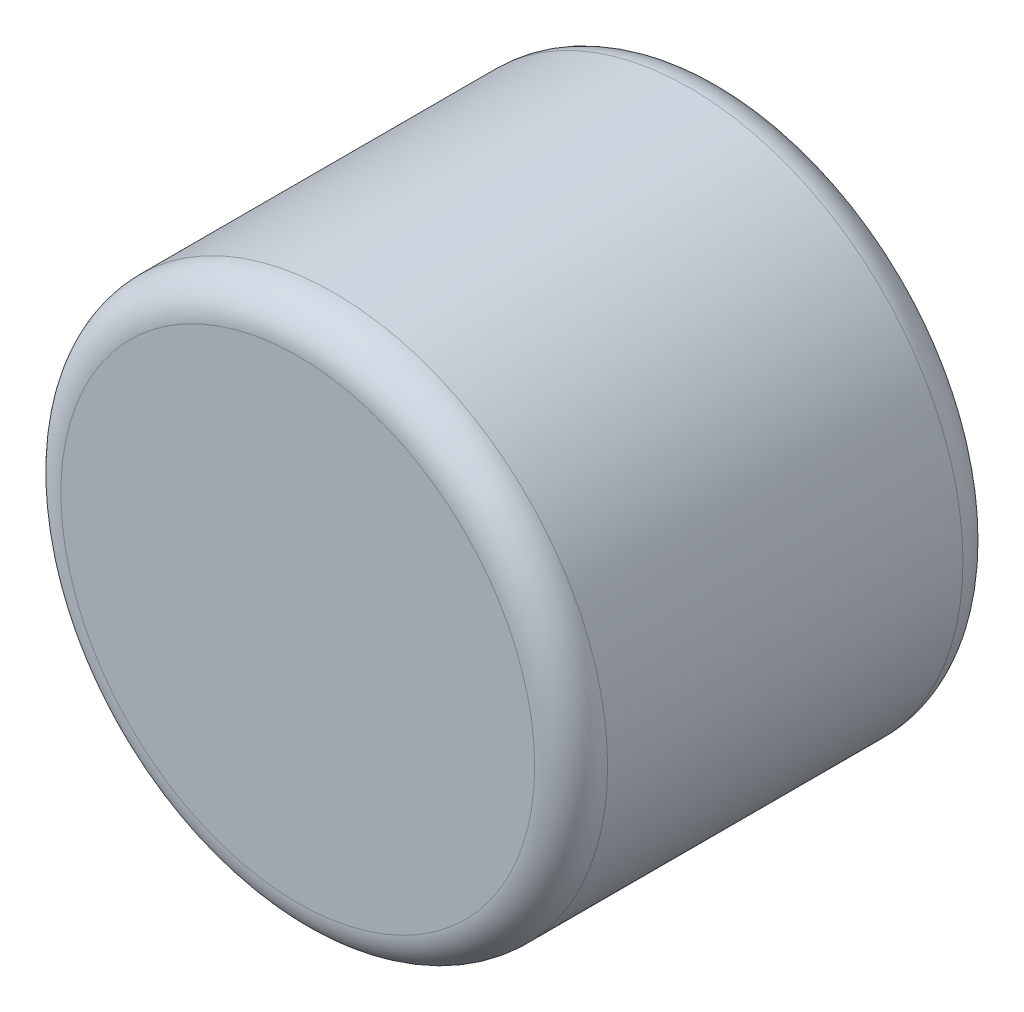
ISO-10303-21;
HEADER;
FILE_DESCRIPTION(('STEP AP214'),'2;1');
FILE_NAME('part.step','',(''),(''),'','','');
FILE_SCHEMA(('AUTOMOTIVE_DESIGN { 1 0 10303 214 1 1 1 1 }'));
ENDSEC;
DATA;
#1=APPLICATION_CONTEXT('core data for automotive mechanical design processes');
#2=APPLICATION_PROTOCOL_DEFINITION('international standard','automotive_design',2000,#1);
#3=PRODUCT_CONTEXT('',#1,'mechanical');
#4=PRODUCT('Part','Part','',(#3));
#5=PRODUCT_RELATED_PRODUCT_CATEGORY('part','',(#4));
#6=PRODUCT_DEFINITION_FORMATION('','',#4);
#7=PRODUCT_DEFINITION_CONTEXT('part definition',#1,'design');
#8=PRODUCT_DEFINITION('design','',#6,#7);
#9=PRODUCT_DEFINITION_SHAPE('','',#8);
#10=(LENGTH_UNIT() NAMED_UNIT(*) SI_UNIT(.MILLI.,.METRE.));
#11=(NAMED_UNIT(*) PLANE_ANGLE_UNIT() SI_UNIT($,.RADIAN.));
#12=(NAMED_UNIT(*) SI_UNIT($,.STERADIAN.) SOLID_ANGLE_UNIT());
#13=UNCERTAINTY_MEASURE_WITH_UNIT(LENGTH_MEASURE(1.E-05),#10,'distance_accuracy_value','');
#14=(GEOMETRIC_REPRESENTATION_CONTEXT(3) GLOBAL_UNCERTAINTY_ASSIGNED_CONTEXT((#13)) GLOBAL_UNIT_ASSIGNED_CONTEXT((#10,
#11,#12)) REPRESENTATION_CONTEXT('',''));
#15=CARTESIAN_POINT('',(0.,0.,0.));
#16=DIRECTION('',(0.,0.,1.));
#17=DIRECTION('',(1.,0.,0.));
#18=AXIS2_PLACEMENT_3D('',#15,#16,#17);
#19=CARTESIAN_POINT('',(0.,0.,2.75));
#20=DIRECTION('',(0.,0.,1.));
#21=DIRECTION('',(1.,0.,0.));
#22=AXIS2_PLACEMENT_3D('',#19,#20,#21);
#23=CYLINDRICAL_SURFACE('',#22,3.05);
#24=CARTESIAN_POINT('',(0.,0.,9.75));
#25=DIRECTION('',(0.,0.,1.));
#26=DIRECTION('',(1.,0.,0.));
#27=AXIS2_PLACEMENT_3D('',#24,#25,#26);
#28=CIRCLE('',#27,3.05);
#29=CARTESIAN_POINT('',(2.6556543449779,-1.5,9.75));
#30=VERTEX_POINT('',#29);
#31=CARTESIAN_POINT('',(-2.6556543449779,-1.5,9.75));
#32=VERTEX_POINT('',#31);
#33=EDGE_CURVE('E75',#30,#32,#28,.T.);
#34=ORIENTED_EDGE('',*,*,#33,.T.);
#35=DIRECTION('',(0.,0.,1.));
#36=VECTOR('',#35,1.);
#37=CARTESIAN_POINT('',(-2.6556543449779,-1.5,2.75));
#38=LINE('',#37,#36);
#39=CARTESIAN_POINT('',(-2.6556543449779,-1.5,2.75));
#40=VERTEX_POINT('',#39);
#41=EDGE_CURVE('E64',#40,#32,#38,.T.);
#42=ORIENTED_EDGE('',*,*,#41,.F.);
#43=CARTESIAN_POINT('',(0.,0.,2.75));
#44=DIRECTION('',(0.,0.,-1.));
#45=DIRECTION('',(-1.,0.,0.));
#46=AXIS2_PLACEMENT_3D('',#43,#44,#45);
#47=CIRCLE('',#46,3.05);
#48=CARTESIAN_POINT('',(2.6556543449779,-1.5,2.75));
#49=VERTEX_POINT('',#48);
#50=EDGE_CURVE('E54',#49,#40,#47,.T.);
#51=ORIENTED_EDGE('',*,*,#50,.F.);
#52=DIRECTION('',(0.,0.,1.));
#53=VECTOR('',#52,1.);
#54=CARTESIAN_POINT('',(2.6556543449779,-1.5,2.75));
#55=LINE('',#54,#53);
#56=EDGE_CURVE('E73',#49,#30,#55,.T.);
#57=ORIENTED_EDGE('',*,*,#56,.T.);
#58=EDGE_LOOP('',(#34,#42,#51,#57));
#59=FACE_BOUND('',#58,.T.);
#60=CARTESIAN_POINT('',(0.,0.,0.));
#61=DIRECTION('',(0.,0.,-1.));
#62=DIRECTION('',(-1.,0.,0.));
#63=AXIS2_PLACEMENT_3D('',#60,#61,#62);
#64=CIRCLE('',#63,3.05);
#65=CARTESIAN_POINT('',(-3.05,0.,0.));
#66=VERTEX_POINT('',#65);
#67=EDGE_CURVE('E76',#66,#66,#64,.T.);
#68=ORIENTED_EDGE('',*,*,#67,.T.);
#69=EDGE_LOOP('',(#68));
#70=FACE_BOUND('',#69,.T.);
#71=ADVANCED_FACE('F39',(#59,#70),#23,.F.);
#72=CARTESIAN_POINT('',(-2.6556543449779,-1.5,2.75));
#73=DIRECTION('',(0.,-1.,0.));
#74=DIRECTION('',(0.,0.,-1.));
#75=AXIS2_PLACEMENT_3D('',#72,#73,#74);
#76=PLANE('',#75);
#77=DIRECTION('',(1.,0.,0.));
#78=VECTOR('',#77,1.);
#79=CARTESIAN_POINT('',(-2.6556543449779,-1.5,9.75));
#80=LINE('',#79,#78);
#81=EDGE_CURVE('E69',#32,#30,#80,.T.);
#82=ORIENTED_EDGE('',*,*,#81,.T.);
#83=ORIENTED_EDGE('',*,*,#56,.F.);
#84=DIRECTION('',(1.,0.,0.));
#85=VECTOR('',#84,1.);
#86=CARTESIAN_POINT('',(-2.6556543449779,-1.5,2.75));
#87=LINE('',#86,#85);
#88=EDGE_CURVE('E66',#40,#49,#87,.T.);
#89=ORIENTED_EDGE('',*,*,#88,.F.);
#90=ORIENTED_EDGE('',*,*,#41,.T.);
#91=EDGE_LOOP('',(#82,#83,#89,#90));
#92=FACE_BOUND('',#91,.T.);
#93=ADVANCED_FACE('F78',(#92),#76,.F.);
#94=CARTESIAN_POINT('',(0.,0.,9.75));
#95=DIRECTION('',(0.,0.,1.));
#96=DIRECTION('',(1.,0.,0.));
#97=AXIS2_PLACEMENT_3D('',#94,#95,#96);
#98=PLANE('',#97);
#99=ORIENTED_EDGE('',*,*,#33,.F.);
#100=ORIENTED_EDGE('',*,*,#81,.F.);
#101=EDGE_LOOP('',(#99,#100));
#102=FACE_BOUND('',#101,.T.);
#103=ADVANCED_FACE('F118',(#102),#98,.F.);
#104=CARTESIAN_POINT('',(0.,0.,2.75));
#105=DIRECTION('',(0.,0.,-1.));
#106=DIRECTION('',(-1.,0.,0.));
#107=AXIS2_PLACEMENT_3D('',#104,#105,#106);
#108=PLANE('',#107);
#109=ORIENTED_EDGE('',*,*,#88,.T.);
#110=ORIENTED_EDGE('',*,*,#50,.T.);
#111=EDGE_LOOP('',(#109,#110));
#112=FACE_BOUND('',#111,.T.);
#113=ADVANCED_FACE('F67',(#112),#108,.T.);
#114=CARTESIAN_POINT('',(0.,0.,11.75));
#115=DIRECTION('',(0.,0.,-1.));
#116=DIRECTION('',(-1.,0.,0.));
#117=AXIS2_PLACEMENT_3D('',#114,#115,#116);
#118=CYLINDRICAL_SURFACE('',#117,7.5);
#119=CARTESIAN_POINT('',(0.,0.,10.75));
#120=DIRECTION('',(0.,0.,1.));
#121=DIRECTION('',(1.,0.,0.));
#122=AXIS2_PLACEMENT_3D('',#119,#120,#121);
#123=CIRCLE('',#122,7.5);
#124=CARTESIAN_POINT('',(7.5,0.,10.75));
#125=VERTEX_POINT('',#124);
#126=EDGE_CURVE('E48',#125,#125,#123,.F.);
#127=ORIENTED_EDGE('',*,*,#126,.T.);
#128=EDGE_LOOP('',(#127));
#129=FACE_BOUND('',#128,.T.);
#130=CARTESIAN_POINT('',(0.,0.,1.));
#131=DIRECTION('',(0.,0.,1.));
#132=DIRECTION('',(1.,0.,0.));
#133=AXIS2_PLACEMENT_3D('',#130,#131,#132);
#134=CIRCLE('',#133,7.5);
#135=CARTESIAN_POINT('',(7.5,0.,1.));
#136=VERTEX_POINT('',#135);
#137=EDGE_CURVE('E83',#136,#136,#134,.T.);
#138=ORIENTED_EDGE('',*,*,#137,.T.);
#139=EDGE_LOOP('',(#138));
#140=FACE_BOUND('',#139,.T.);
#141=ADVANCED_FACE('F93',(#129,#140),#118,.T.);
#142=CARTESIAN_POINT('',(0.,0.,11.75));
#143=DIRECTION('',(0.,0.,1.));
#144=DIRECTION('',(1.,0.,0.));
#145=AXIS2_PLACEMENT_3D('',#142,#143,#144);
#146=PLANE('',#145);
#147=CARTESIAN_POINT('',(0.,0.,11.75));
#148=DIRECTION('',(0.,0.,1.));
#149=DIRECTION('',(1.,0.,0.));
#150=AXIS2_PLACEMENT_3D('',#147,#148,#149);
#151=CIRCLE('',#150,6.5);
#152=CARTESIAN_POINT('',(6.5,0.,11.75));
#153=VERTEX_POINT('',#152);
#154=EDGE_CURVE('E80',#153,#153,#151,.T.);
#155=ORIENTED_EDGE('',*,*,#154,.T.);
#156=EDGE_LOOP('',(#155));
#157=FACE_BOUND('',#156,.T.);
#158=ADVANCED_FACE('F102',(#157),#146,.T.);
#159=CARTESIAN_POINT('',(0.,0.,0.));
#160=DIRECTION('',(0.,0.,1.));
#161=DIRECTION('',(1.,0.,0.));
#162=AXIS2_PLACEMENT_3D('',#159,#160,#161);
#163=PLANE('',#162);
#164=ORIENTED_EDGE('',*,*,#67,.F.);
#165=EDGE_LOOP('',(#164));
#166=FACE_BOUND('',#165,.T.);
#167=CARTESIAN_POINT('',(0.,0.,0.));
#168=DIRECTION('',(0.,0.,1.));
#169=DIRECTION('',(1.,0.,0.));
#170=AXIS2_PLACEMENT_3D('',#167,#168,#169);
#171=CIRCLE('',#170,6.5);
#172=CARTESIAN_POINT('',(6.5,0.,0.));
#173=VERTEX_POINT('',#172);
#174=EDGE_CURVE('E11',#173,#173,#171,.F.);
#175=ORIENTED_EDGE('',*,*,#174,.T.);
#176=EDGE_LOOP('',(#175));
#177=FACE_BOUND('',#176,.T.);
#178=ADVANCED_FACE('F99',(#166,#177),#163,.F.);
#179=CARTESIAN_POINT('',(0.,0.,10.75));
#180=DIRECTION('',(0.,0.,1.));
#181=DIRECTION('',(1.,0.,0.));
#182=AXIS2_PLACEMENT_3D('',#179,#180,#181);
#183=TOROIDAL_SURFACE('',#182,6.5,1.);
#184=ORIENTED_EDGE('',*,*,#126,.F.);
#185=EDGE_LOOP('',(#184));
#186=FACE_BOUND('',#185,.T.);
#187=ORIENTED_EDGE('',*,*,#154,.F.);
#188=EDGE_LOOP('',(#187));
#189=FACE_BOUND('',#188,.T.);
#190=ADVANCED_FACE('F96',(#186,#189),#183,.T.);
#191=CARTESIAN_POINT('',(0.,0.,1.));
#192=DIRECTION('',(0.,0.,1.));
#193=DIRECTION('',(1.,0.,0.));
#194=AXIS2_PLACEMENT_3D('',#191,#192,#193);
#195=TOROIDAL_SURFACE('',#194,6.5,1.);
#196=ORIENTED_EDGE('',*,*,#174,.F.);
#197=EDGE_LOOP('',(#196));
#198=FACE_BOUND('',#197,.T.);
#199=ORIENTED_EDGE('',*,*,#137,.F.);
#200=EDGE_LOOP('',(#199));
#201=FACE_BOUND('',#200,.T.);
#202=ADVANCED_FACE('F41',(#198,#201),#195,.T.);
#203=CLOSED_SHELL('',(#71,#93,#103,#113,#141,#158,#178,#190,#202));
#204=MANIFOLD_SOLID_BREP('B2',#203);
#205=ADVANCED_BREP_SHAPE_REPRESENTATION('',(#18,#204),#14);
#206=SHAPE_DEFINITION_REPRESENTATION(#9,#205);
ENDSEC;
END-ISO-10303-21;
